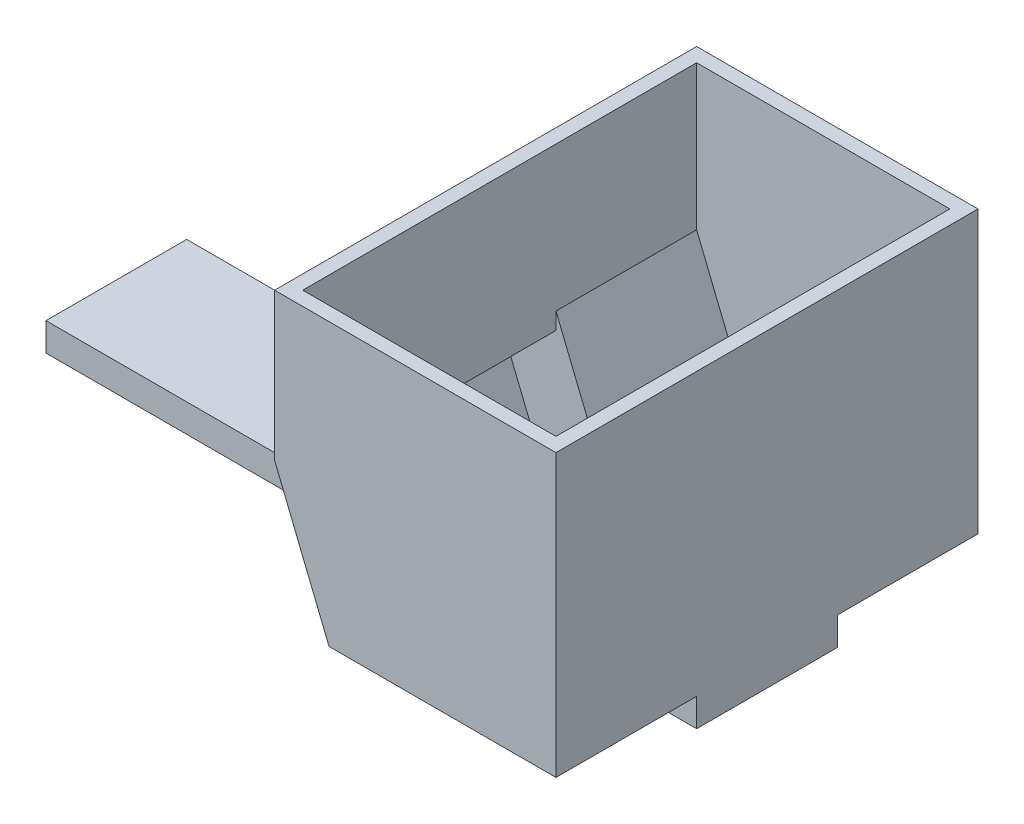
ISO-10303-21;
HEADER;
FILE_DESCRIPTION(('STEP AP214'),'2;1');
FILE_NAME('part.step','',(''),(''),'','','');
FILE_SCHEMA(('AUTOMOTIVE_DESIGN { 1 0 10303 214 1 1 1 1 }'));
ENDSEC;
DATA;
#1=APPLICATION_CONTEXT('core data for automotive mechanical design processes');
#2=APPLICATION_PROTOCOL_DEFINITION('international standard','automotive_design',2000,#1);
#3=PRODUCT_CONTEXT('',#1,'mechanical');
#4=PRODUCT('Part','Part','',(#3));
#5=PRODUCT_RELATED_PRODUCT_CATEGORY('part','',(#4));
#6=PRODUCT_DEFINITION_FORMATION('','',#4);
#7=PRODUCT_DEFINITION_CONTEXT('part definition',#1,'design');
#8=PRODUCT_DEFINITION('design','',#6,#7);
#9=PRODUCT_DEFINITION_SHAPE('','',#8);
#10=(LENGTH_UNIT() NAMED_UNIT(*) SI_UNIT(.MILLI.,.METRE.));
#11=(NAMED_UNIT(*) PLANE_ANGLE_UNIT() SI_UNIT($,.RADIAN.));
#12=(NAMED_UNIT(*) SI_UNIT($,.STERADIAN.) SOLID_ANGLE_UNIT());
#13=UNCERTAINTY_MEASURE_WITH_UNIT(LENGTH_MEASURE(1.E-05),#10,'distance_accuracy_value','');
#14=(GEOMETRIC_REPRESENTATION_CONTEXT(3) GLOBAL_UNCERTAINTY_ASSIGNED_CONTEXT((#13)) GLOBAL_UNIT_ASSIGNED_CONTEXT((#10,
#11,#12)) REPRESENTATION_CONTEXT('',''));
#15=CARTESIAN_POINT('',(0.,0.,0.));
#16=DIRECTION('',(0.,0.,1.));
#17=DIRECTION('',(1.,0.,0.));
#18=AXIS2_PLACEMENT_3D('',#15,#16,#17);
#19=CARTESIAN_POINT('',(0.,-482.915977060569,2000.));
#20=DIRECTION('',(0.,1.,0.));
#21=DIRECTION('',(0.,0.,1.));
#22=AXIS2_PLACEMENT_3D('',#19,#20,#21);
#23=PLANE('',#22);
#24=DIRECTION('',(1.,0.,0.));
#25=VECTOR('',#24,1.);
#26=CARTESIAN_POINT('',(0.,-482.915977060569,0.));
#27=LINE('',#26,#25);
#28=CARTESIAN_POINT('',(4250.,-482.915977060569,0.));
#29=VERTEX_POINT('',#28);
#30=CARTESIAN_POINT('',(5250.,-482.915977060569,0.));
#31=VERTEX_POINT('',#30);
#32=EDGE_CURVE('E166',#29,#31,#27,.T.);
#33=ORIENTED_EDGE('',*,*,#32,.F.);
#34=DIRECTION('',(0.,0.,-1.));
#35=VECTOR('',#34,1.);
#36=CARTESIAN_POINT('',(4250.,-482.915977060569,2000.));
#37=LINE('',#36,#35);
#38=CARTESIAN_POINT('',(4250.,-482.915977060569,2000.));
#39=VERTEX_POINT('',#38);
#40=EDGE_CURVE('E53',#39,#29,#37,.T.);
#41=ORIENTED_EDGE('',*,*,#40,.F.);
#42=DIRECTION('',(1.,0.,0.));
#43=VECTOR('',#42,1.);
#44=CARTESIAN_POINT('',(0.,-482.915977060569,2000.));
#45=LINE('',#44,#43);
#46=CARTESIAN_POINT('',(5250.,-482.915977060569,2000.));
#47=VERTEX_POINT('',#46);
#48=EDGE_CURVE('E142',#39,#47,#45,.T.);
#49=ORIENTED_EDGE('',*,*,#48,.T.);
#50=DIRECTION('',(0.,0.,-1.));
#51=VECTOR('',#50,1.);
#52=CARTESIAN_POINT('',(5250.,-482.915977060569,2000.));
#53=LINE('',#52,#51);
#54=EDGE_CURVE('E11',#47,#31,#53,.T.);
#55=ORIENTED_EDGE('',*,*,#54,.T.);
#56=EDGE_LOOP('',(#33,#41,#49,#55));
#57=FACE_BOUND('',#56,.T.);
#58=ADVANCED_FACE('F45',(#57),#23,.T.);
#59=CARTESIAN_POINT('',(3479.3535466824,1413.73185883282,2000.));
#60=DIRECTION('',(0.926443875866131,0.376432922139045,0.));
#61=DIRECTION('',(-0.376432922139045,0.926443875866131,0.));
#62=AXIS2_PLACEMENT_3D('',#59,#60,#61);
#63=PLANE('',#62);
#64=DIRECTION('',(0.376432922139045,-0.926443875866131,0.));
#65=VECTOR('',#64,1.);
#66=CARTESIAN_POINT('',(3479.3535466824,1413.73185883282,0.));
#67=LINE('',#66,#65);
#68=CARTESIAN_POINT('',(5023.74065912223,-2387.17900240678,0.));
#69=VERTEX_POINT('',#68);
#70=EDGE_CURVE('E171',#29,#69,#67,.T.);
#71=ORIENTED_EDGE('',*,*,#70,.T.);
#72=DIRECTION('',(0.,0.,-1.));
#73=VECTOR('',#72,1.);
#74=CARTESIAN_POINT('',(5023.74065912223,-2387.17900240678,2000.));
#75=LINE('',#74,#73);
#76=CARTESIAN_POINT('',(5023.74065912223,-2387.17900240678,2000.));
#77=VERTEX_POINT('',#76);
#78=EDGE_CURVE('E124',#77,#69,#75,.T.);
#79=ORIENTED_EDGE('',*,*,#78,.F.);
#80=DIRECTION('',(0.376432922139045,-0.926443875866131,0.));
#81=VECTOR('',#80,1.);
#82=CARTESIAN_POINT('',(3479.3535466824,1413.73185883282,2000.));
#83=LINE('',#82,#81);
#84=EDGE_CURVE('E136',#39,#77,#83,.T.);
#85=ORIENTED_EDGE('',*,*,#84,.F.);
#86=ORIENTED_EDGE('',*,*,#40,.T.);
#87=EDGE_LOOP('',(#71,#79,#85,#86));
#88=FACE_BOUND('',#87,.T.);
#89=ADVANCED_FACE('F195',(#88),#63,.F.);
#90=CARTESIAN_POINT('',(0.,-2387.17900240678,2000.));
#91=DIRECTION('',(0.,1.,0.));
#92=DIRECTION('',(0.,0.,1.));
#93=AXIS2_PLACEMENT_3D('',#90,#91,#92);
#94=PLANE('',#93);
#95=DIRECTION('',(1.,0.,0.));
#96=VECTOR('',#95,1.);
#97=CARTESIAN_POINT('',(0.,-2387.17900240678,0.));
#98=LINE('',#97,#96);
#99=CARTESIAN_POINT('',(0.,-2387.17900240678,0.));
#100=VERTEX_POINT('',#99);
#101=EDGE_CURVE('E120',#100,#69,#98,.T.);
#102=ORIENTED_EDGE('',*,*,#101,.F.);
#103=DIRECTION('',(0.,0.,-1.));
#104=VECTOR('',#103,1.);
#105=CARTESIAN_POINT('',(0.,-2387.17900240678,2000.));
#106=LINE('',#105,#104);
#107=CARTESIAN_POINT('',(0.,-2387.17900240678,2000.));
#108=VERTEX_POINT('',#107);
#109=EDGE_CURVE('E114',#108,#100,#106,.T.);
#110=ORIENTED_EDGE('',*,*,#109,.F.);
#111=DIRECTION('',(1.,0.,0.));
#112=VECTOR('',#111,1.);
#113=CARTESIAN_POINT('',(0.,-2387.17900240678,2000.));
#114=LINE('',#113,#112);
#115=EDGE_CURVE('E118',#108,#77,#114,.T.);
#116=ORIENTED_EDGE('',*,*,#115,.T.);
#117=ORIENTED_EDGE('',*,*,#78,.T.);
#118=EDGE_LOOP('',(#102,#110,#116,#117));
#119=FACE_BOUND('',#118,.T.);
#120=ADVANCED_FACE('F116',(#119),#94,.T.);
#121=CARTESIAN_POINT('',(0.,0.,2000.));
#122=DIRECTION('',(1.,0.,0.));
#123=DIRECTION('',(0.,0.,-1.));
#124=AXIS2_PLACEMENT_3D('',#121,#122,#123);
#125=PLANE('',#124);
#126=DIRECTION('',(0.,-1.,0.));
#127=VECTOR('',#126,1.);
#128=CARTESIAN_POINT('',(0.,0.,0.));
#129=LINE('',#128,#127);
#130=CARTESIAN_POINT('',(0.,-2787.17900240678,0.));
#131=VERTEX_POINT('',#130);
#132=EDGE_CURVE('E177',#100,#131,#129,.T.);
#133=ORIENTED_EDGE('',*,*,#132,.T.);
#134=DIRECTION('',(0.,0.,-1.));
#135=VECTOR('',#134,1.);
#136=CARTESIAN_POINT('',(0.,-2787.17900240678,2000.));
#137=LINE('',#136,#135);
#138=CARTESIAN_POINT('',(0.,-2787.17900240678,2000.));
#139=VERTEX_POINT('',#138);
#140=EDGE_CURVE('E125',#139,#131,#137,.T.);
#141=ORIENTED_EDGE('',*,*,#140,.F.);
#142=DIRECTION('',(0.,-1.,0.));
#143=VECTOR('',#142,1.);
#144=CARTESIAN_POINT('',(0.,0.,2000.));
#145=LINE('',#144,#143);
#146=EDGE_CURVE('E128',#108,#139,#145,.T.);
#147=ORIENTED_EDGE('',*,*,#146,.F.);
#148=ORIENTED_EDGE('',*,*,#109,.T.);
#149=EDGE_LOOP('',(#133,#141,#147,#148));
#150=FACE_BOUND('',#149,.T.);
#151=ADVANCED_FACE('F129',(#150),#125,.F.);
#152=CARTESIAN_POINT('',(0.,-2787.17900240678,2000.));
#153=DIRECTION('',(0.,1.,0.));
#154=DIRECTION('',(0.,0.,1.));
#155=AXIS2_PLACEMENT_3D('',#152,#153,#154);
#156=PLANE('',#155);
#157=DIRECTION('',(1.,0.,0.));
#158=VECTOR('',#157,1.);
#159=CARTESIAN_POINT('',(0.,-2787.17900240678,0.));
#160=LINE('',#159,#158);
#161=CARTESIAN_POINT('',(9250.,-2787.17900240678,0.));
#162=VERTEX_POINT('',#161);
#163=EDGE_CURVE('E181',#131,#162,#160,.T.);
#164=ORIENTED_EDGE('',*,*,#163,.T.);
#165=DIRECTION('',(0.,0.,-1.));
#166=VECTOR('',#165,1.);
#167=CARTESIAN_POINT('',(9250.,-2787.17900240678,2000.));
#168=LINE('',#167,#166);
#169=CARTESIAN_POINT('',(9250.,-2787.17900240678,2000.));
#170=VERTEX_POINT('',#169);
#171=EDGE_CURVE('E146',#170,#162,#168,.T.);
#172=ORIENTED_EDGE('',*,*,#171,.F.);
#173=DIRECTION('',(1.,0.,0.));
#174=VECTOR('',#173,1.);
#175=CARTESIAN_POINT('',(0.,-2787.17900240678,2000.));
#176=LINE('',#175,#174);
#177=EDGE_CURVE('E69',#139,#170,#176,.T.);
#178=ORIENTED_EDGE('',*,*,#177,.F.);
#179=ORIENTED_EDGE('',*,*,#140,.T.);
#180=EDGE_LOOP('',(#164,#172,#178,#179));
#181=FACE_BOUND('',#180,.T.);
#182=ADVANCED_FACE('F461',(#181),#156,.F.);
#183=CARTESIAN_POINT('',(9250.,0.,2000.));
#184=DIRECTION('',(1.,0.,0.));
#185=DIRECTION('',(0.,0.,-1.));
#186=AXIS2_PLACEMENT_3D('',#183,#184,#185);
#187=PLANE('',#186);
#188=DIRECTION('',(0.,-1.,0.));
#189=VECTOR('',#188,1.);
#190=CARTESIAN_POINT('',(9250.,0.,0.));
#191=LINE('',#190,#189);
#192=CARTESIAN_POINT('',(9250.,-2387.17900240678,0.));
#193=VERTEX_POINT('',#192);
#194=EDGE_CURVE('E185',#193,#162,#191,.T.);
#195=ORIENTED_EDGE('',*,*,#194,.F.);
#196=DIRECTION('',(0.,0.,1.));
#197=VECTOR('',#196,1.);
#198=CARTESIAN_POINT('',(9250.,-2387.17900240678,-2000.));
#199=LINE('',#198,#197);
#200=CARTESIAN_POINT('',(9250.,-2387.17900240678,-2000.));
#201=VERTEX_POINT('',#200);
#202=EDGE_CURVE('E239',#201,#193,#199,.T.);
#203=ORIENTED_EDGE('',*,*,#202,.F.);
#204=DIRECTION('',(0.,1.,0.));
#205=VECTOR('',#204,1.);
#206=CARTESIAN_POINT('',(9250.,-4.10782519111308E-12,-2000.));
#207=LINE('',#206,#205);
#208=CARTESIAN_POINT('',(9250.,1612.82099759322,-2000.));
#209=VERTEX_POINT('',#208);
#210=EDGE_CURVE('E232',#201,#209,#207,.T.);
#211=ORIENTED_EDGE('',*,*,#210,.T.);
#212=DIRECTION('',(0.,0.,1.));
#213=VECTOR('',#212,1.);
#214=CARTESIAN_POINT('',(9250.,1612.82099759322,-2000.));
#215=LINE('',#214,#213);
#216=CARTESIAN_POINT('',(9250.,1612.82099759322,4000.));
#217=VERTEX_POINT('',#216);
#218=EDGE_CURVE('E167',#209,#217,#215,.T.);
#219=ORIENTED_EDGE('',*,*,#218,.T.);
#220=DIRECTION('',(0.,1.,0.));
#221=VECTOR('',#220,1.);
#222=CARTESIAN_POINT('',(9250.,-4.10782519111308E-12,4000.));
#223=LINE('',#222,#221);
#224=CARTESIAN_POINT('',(9250.,-2387.17900240678,4000.));
#225=VERTEX_POINT('',#224);
#226=EDGE_CURVE('E263',#225,#217,#223,.T.);
#227=ORIENTED_EDGE('',*,*,#226,.F.);
#228=CARTESIAN_POINT('',(9250.,-2387.17900240678,2000.));
#229=VERTEX_POINT('',#228);
#230=EDGE_CURVE('E238',#229,#225,#199,.T.);
#231=ORIENTED_EDGE('',*,*,#230,.F.);
#232=DIRECTION('',(0.,-1.,0.));
#233=VECTOR('',#232,1.);
#234=CARTESIAN_POINT('',(9250.,0.,2000.));
#235=LINE('',#234,#233);
#236=EDGE_CURVE('E147',#229,#170,#235,.T.);
#237=ORIENTED_EDGE('',*,*,#236,.T.);
#238=ORIENTED_EDGE('',*,*,#171,.T.);
#239=EDGE_LOOP('',(#195,#203,#211,#219,#227,#231,#237,#238));
#240=FACE_BOUND('',#239,.T.);
#241=ADVANCED_FACE('F464',(#240),#187,.T.);
#242=CARTESIAN_POINT('',(0.,0.,2000.));
#243=DIRECTION('',(0.,0.,1.));
#244=DIRECTION('',(1.,0.,0.));
#245=AXIS2_PLACEMENT_3D('',#242,#243,#244);
#246=PLANE('',#245);
#247=CARTESIAN_POINT('',(4895.35301422682,-895.900869711244,2000.));
#248=DIRECTION('',(0.,0.,1.));
#249=DIRECTION('',(1.,0.,0.));
#250=AXIS2_PLACEMENT_3D('',#247,#248,#249);
#251=CIRCLE('',#250,100.);
#252=CARTESIAN_POINT('',(4995.35301422682,-895.900869711244,2000.));
#253=VERTEX_POINT('',#252);
#254=EDGE_CURVE('E423',#253,#253,#251,.T.);
#255=ORIENTED_EDGE('',*,*,#254,.F.);
#256=EDGE_LOOP('',(#255));
#257=FACE_BOUND('',#256,.T.);
#258=DIRECTION('',(0.376432922139045,-0.926443875866131,0.));
#259=VECTOR('',#258,1.);
#260=CARTESIAN_POINT('',(4337.65180181226,1762.47583422293,2000.));
#261=LINE('',#260,#259);
#262=CARTESIAN_POINT('',(6023.74065912223,-2387.17900240678,2000.));
#263=VERTEX_POINT('',#262);
#264=EDGE_CURVE('E218',#47,#263,#261,.T.);
#265=ORIENTED_EDGE('',*,*,#264,.F.);
#266=ORIENTED_EDGE('',*,*,#48,.F.);
#267=ORIENTED_EDGE('',*,*,#84,.T.);
#268=ORIENTED_EDGE('',*,*,#115,.F.);
#269=ORIENTED_EDGE('',*,*,#146,.T.);
#270=ORIENTED_EDGE('',*,*,#177,.T.);
#271=ORIENTED_EDGE('',*,*,#236,.F.);
#272=EDGE_CURVE('E140',#263,#229,#114,.T.);
#273=ORIENTED_EDGE('',*,*,#272,.F.);
#274=EDGE_LOOP('',(#265,#266,#267,#268,#269,#270,#271,#273));
#275=FACE_BOUND('',#274,.T.);
#276=ADVANCED_FACE('F134',(#257,#275),#246,.T.);
#277=CARTESIAN_POINT('',(0.,0.,0.));
#278=DIRECTION('',(0.,0.,1.));
#279=DIRECTION('',(1.,0.,0.));
#280=AXIS2_PLACEMENT_3D('',#277,#278,#279);
#281=PLANE('',#280);
#282=CARTESIAN_POINT('',(5156.86100387001,-1595.06633267698,0.));
#283=DIRECTION('',(0.,0.,1.));
#284=DIRECTION('',(1.,0.,0.));
#285=AXIS2_PLACEMENT_3D('',#282,#283,#284);
#286=CIRCLE('',#285,100.);
#287=CARTESIAN_POINT('',(5256.86100387001,-1595.06633267698,0.));
#288=VERTEX_POINT('',#287);
#289=EDGE_CURVE('E431',#288,#288,#286,.T.);
#290=ORIENTED_EDGE('',*,*,#289,.T.);
#291=EDGE_LOOP('',(#290));
#292=FACE_BOUND('',#291,.T.);
#293=DIRECTION('',(0.376432922139045,-0.926443875866131,0.));
#294=VECTOR('',#293,1.);
#295=CARTESIAN_POINT('',(4337.65180181226,1762.47583422293,0.));
#296=LINE('',#295,#294);
#297=CARTESIAN_POINT('',(6023.74065912223,-2387.17900240678,0.));
#298=VERTEX_POINT('',#297);
#299=EDGE_CURVE('E162',#31,#298,#296,.T.);
#300=ORIENTED_EDGE('',*,*,#299,.T.);
#301=EDGE_CURVE('E178',#298,#193,#98,.T.);
#302=ORIENTED_EDGE('',*,*,#301,.T.);
#303=ORIENTED_EDGE('',*,*,#194,.T.);
#304=ORIENTED_EDGE('',*,*,#163,.F.);
#305=ORIENTED_EDGE('',*,*,#132,.F.);
#306=ORIENTED_EDGE('',*,*,#101,.T.);
#307=ORIENTED_EDGE('',*,*,#70,.F.);
#308=ORIENTED_EDGE('',*,*,#32,.T.);
#309=EDGE_LOOP('',(#300,#302,#303,#304,#305,#306,#307,#308));
#310=FACE_BOUND('',#309,.T.);
#311=ADVANCED_FACE('F197',(#292,#310),#281,.F.);
#312=CARTESIAN_POINT('',(0.,-2387.17900240678,-2000.));
#313=DIRECTION('',(0.,-1.,0.));
#314=DIRECTION('',(0.,0.,-1.));
#315=AXIS2_PLACEMENT_3D('',#312,#313,#314);
#316=PLANE('',#315);
#317=ORIENTED_EDGE('',*,*,#301,.F.);
#318=DIRECTION('',(0.,0.,1.));
#319=VECTOR('',#318,1.);
#320=CARTESIAN_POINT('',(6023.74065912223,-2387.17900240678,-2000.));
#321=LINE('',#320,#319);
#322=CARTESIAN_POINT('',(6023.74065912223,-2387.17900240678,-2000.));
#323=VERTEX_POINT('',#322);
#324=EDGE_CURVE('E97',#323,#298,#321,.T.);
#325=ORIENTED_EDGE('',*,*,#324,.F.);
#326=DIRECTION('',(1.,0.,0.));
#327=VECTOR('',#326,1.);
#328=CARTESIAN_POINT('',(0.,-2387.17900240678,-2000.));
#329=LINE('',#328,#327);
#330=EDGE_CURVE('E249',#323,#201,#329,.T.);
#331=ORIENTED_EDGE('',*,*,#330,.T.);
#332=ORIENTED_EDGE('',*,*,#202,.T.);
#333=EDGE_LOOP('',(#317,#325,#331,#332));
#334=FACE_BOUND('',#333,.T.);
#335=ADVANCED_FACE('F470',(#334),#316,.T.);
#336=CARTESIAN_POINT('',(4337.65180181226,1762.47583422293,-2000.));
#337=DIRECTION('',(-0.926443875866131,-0.376432922139045,0.));
#338=DIRECTION('',(0.376432922139045,-0.926443875866131,0.));
#339=AXIS2_PLACEMENT_3D('',#336,#337,#338);
#340=PLANE('',#339);
#341=ORIENTED_EDGE('',*,*,#299,.F.);
#342=DIRECTION('',(0.,0.,1.));
#343=VECTOR('',#342,1.);
#344=CARTESIAN_POINT('',(5250.,-482.915977060569,-2000.));
#345=LINE('',#344,#343);
#346=CARTESIAN_POINT('',(5250.,-482.915977060569,-2000.));
#347=VERTEX_POINT('',#346);
#348=EDGE_CURVE('E214',#347,#31,#345,.T.);
#349=ORIENTED_EDGE('',*,*,#348,.F.);
#350=DIRECTION('',(0.376432922139045,-0.926443875866131,0.));
#351=VECTOR('',#350,1.);
#352=CARTESIAN_POINT('',(4337.65180181226,1762.47583422293,-2000.));
#353=LINE('',#352,#351);
#354=EDGE_CURVE('E253',#347,#323,#353,.T.);
#355=ORIENTED_EDGE('',*,*,#354,.T.);
#356=ORIENTED_EDGE('',*,*,#324,.T.);
#357=EDGE_LOOP('',(#341,#349,#355,#356));
#358=FACE_BOUND('',#357,.T.);
#359=ADVANCED_FACE('F479',(#358),#340,.T.);
#360=CARTESIAN_POINT('',(0.,1612.82099759322,-2000.));
#361=DIRECTION('',(0.,1.,0.));
#362=DIRECTION('',(0.,0.,1.));
#363=AXIS2_PLACEMENT_3D('',#360,#361,#362);
#364=PLANE('',#363);
#365=DIRECTION('',(0.,0.,1.));
#366=VECTOR('',#365,1.);
#367=CARTESIAN_POINT('',(5450.,1612.82099759322,-2000.));
#368=LINE('',#367,#366);
#369=CARTESIAN_POINT('',(5450.,1612.82099759322,-1800.));
#370=VERTEX_POINT('',#369);
#371=CARTESIAN_POINT('',(5450.,1612.82099759322,3800.));
#372=VERTEX_POINT('',#371);
#373=EDGE_CURVE('E289',#370,#372,#368,.T.);
#374=ORIENTED_EDGE('',*,*,#373,.F.);
#375=DIRECTION('',(-1.,0.,0.));
#376=VECTOR('',#375,1.);
#377=CARTESIAN_POINT('',(0.,1612.82099759322,-1800.));
#378=LINE('',#377,#376);
#379=CARTESIAN_POINT('',(9050.,1612.82099759322,-1800.));
#380=VERTEX_POINT('',#379);
#381=EDGE_CURVE('E294',#380,#370,#378,.T.);
#382=ORIENTED_EDGE('',*,*,#381,.F.);
#383=DIRECTION('',(0.,0.,1.));
#384=VECTOR('',#383,1.);
#385=CARTESIAN_POINT('',(9050.,1612.82099759322,2000.));
#386=LINE('',#385,#384);
#387=CARTESIAN_POINT('',(9050.,1612.82099759322,3800.));
#388=VERTEX_POINT('',#387);
#389=EDGE_CURVE('E299',#380,#388,#386,.T.);
#390=ORIENTED_EDGE('',*,*,#389,.T.);
#391=DIRECTION('',(-1.,0.,0.));
#392=VECTOR('',#391,1.);
#393=CARTESIAN_POINT('',(0.,1612.82099759322,3800.));
#394=LINE('',#393,#392);
#395=EDGE_CURVE('E283',#388,#372,#394,.T.);
#396=ORIENTED_EDGE('',*,*,#395,.T.);
#397=EDGE_LOOP('',(#374,#382,#390,#396));
#398=FACE_BOUND('',#397,.T.);
#399=DIRECTION('',(0.,0.,1.));
#400=VECTOR('',#399,1.);
#401=CARTESIAN_POINT('',(5250.,1612.82099759322,-2000.));
#402=LINE('',#401,#400);
#403=CARTESIAN_POINT('',(5250.,1612.82099759322,-2000.));
#404=VERTEX_POINT('',#403);
#405=CARTESIAN_POINT('',(5250.,1612.82099759322,4000.));
#406=VERTEX_POINT('',#405);
#407=EDGE_CURVE('E228',#404,#406,#402,.T.);
#408=ORIENTED_EDGE('',*,*,#407,.T.);
#409=DIRECTION('',(-1.,0.,0.));
#410=VECTOR('',#409,1.);
#411=CARTESIAN_POINT('',(0.,1612.82099759322,4000.));
#412=LINE('',#411,#410);
#413=EDGE_CURVE('E278',#217,#406,#412,.T.);
#414=ORIENTED_EDGE('',*,*,#413,.F.);
#415=ORIENTED_EDGE('',*,*,#218,.F.);
#416=DIRECTION('',(-1.,0.,0.));
#417=VECTOR('',#416,1.);
#418=CARTESIAN_POINT('',(0.,1612.82099759322,-2000.));
#419=LINE('',#418,#417);
#420=EDGE_CURVE('E259',#209,#404,#419,.T.);
#421=ORIENTED_EDGE('',*,*,#420,.T.);
#422=EDGE_LOOP('',(#408,#414,#415,#421));
#423=FACE_BOUND('',#422,.T.);
#424=ADVANCED_FACE('F475',(#398,#423),#364,.T.);
#425=CARTESIAN_POINT('',(6023.74065912223,-2387.17900240678,4000.));
#426=VERTEX_POINT('',#425);
#427=EDGE_CURVE('E235',#263,#426,#321,.T.);
#428=ORIENTED_EDGE('',*,*,#427,.F.);
#429=ORIENTED_EDGE('',*,*,#272,.T.);
#430=ORIENTED_EDGE('',*,*,#230,.T.);
#431=DIRECTION('',(1.,0.,0.));
#432=VECTOR('',#431,1.);
#433=CARTESIAN_POINT('',(0.,-2387.17900240678,4000.));
#434=LINE('',#433,#432);
#435=EDGE_CURVE('E267',#426,#225,#434,.T.);
#436=ORIENTED_EDGE('',*,*,#435,.F.);
#437=EDGE_LOOP('',(#428,#429,#430,#436));
#438=FACE_BOUND('',#437,.T.);
#439=ADVANCED_FACE('F478',(#438),#316,.T.);
#440=CARTESIAN_POINT('',(5250.,-482.915977060569,4000.));
#441=VERTEX_POINT('',#440);
#442=EDGE_CURVE('E210',#47,#441,#345,.T.);
#443=ORIENTED_EDGE('',*,*,#442,.F.);
#444=ORIENTED_EDGE('',*,*,#264,.T.);
#445=ORIENTED_EDGE('',*,*,#427,.T.);
#446=DIRECTION('',(0.376432922139045,-0.926443875866131,0.));
#447=VECTOR('',#446,1.);
#448=CARTESIAN_POINT('',(4337.65180181226,1762.47583422293,4000.));
#449=LINE('',#448,#447);
#450=EDGE_CURVE('E271',#441,#426,#449,.T.);
#451=ORIENTED_EDGE('',*,*,#450,.F.);
#452=EDGE_LOOP('',(#443,#444,#445,#451));
#453=FACE_BOUND('',#452,.T.);
#454=ADVANCED_FACE('F484',(#453),#340,.T.);
#455=CARTESIAN_POINT('',(5250.,0.,-2000.));
#456=DIRECTION('',(-1.,0.,0.));
#457=DIRECTION('',(0.,0.,1.));
#458=AXIS2_PLACEMENT_3D('',#455,#456,#457);
#459=PLANE('',#458);
#460=ORIENTED_EDGE('',*,*,#348,.T.);
#461=ORIENTED_EDGE('',*,*,#54,.F.);
#462=ORIENTED_EDGE('',*,*,#442,.T.);
#463=DIRECTION('',(0.,-1.,0.));
#464=VECTOR('',#463,1.);
#465=CARTESIAN_POINT('',(5250.,0.,4000.));
#466=LINE('',#465,#464);
#467=EDGE_CURVE('E275',#406,#441,#466,.T.);
#468=ORIENTED_EDGE('',*,*,#467,.F.);
#469=ORIENTED_EDGE('',*,*,#407,.F.);
#470=DIRECTION('',(0.,-1.,0.));
#471=VECTOR('',#470,1.);
#472=CARTESIAN_POINT('',(5250.,0.,-2000.));
#473=LINE('',#472,#471);
#474=EDGE_CURVE('E256',#404,#347,#473,.T.);
#475=ORIENTED_EDGE('',*,*,#474,.T.);
#476=EDGE_LOOP('',(#460,#461,#462,#468,#469,#475));
#477=FACE_BOUND('',#476,.T.);
#478=ADVANCED_FACE('F206',(#477),#459,.T.);
#479=CARTESIAN_POINT('',(0.,0.,-2000.));
#480=DIRECTION('',(0.,0.,1.));
#481=DIRECTION('',(1.,0.,0.));
#482=AXIS2_PLACEMENT_3D('',#479,#480,#481);
#483=PLANE('',#482);
#484=ORIENTED_EDGE('',*,*,#420,.F.);
#485=ORIENTED_EDGE('',*,*,#210,.F.);
#486=ORIENTED_EDGE('',*,*,#330,.F.);
#487=ORIENTED_EDGE('',*,*,#354,.F.);
#488=ORIENTED_EDGE('',*,*,#474,.F.);
#489=EDGE_LOOP('',(#484,#485,#486,#487,#488));
#490=FACE_BOUND('',#489,.T.);
#491=ADVANCED_FACE('F483',(#490),#483,.F.);
#492=CARTESIAN_POINT('',(0.,0.,4000.));
#493=DIRECTION('',(0.,0.,1.));
#494=DIRECTION('',(1.,0.,0.));
#495=AXIS2_PLACEMENT_3D('',#492,#493,#494);
#496=PLANE('',#495);
#497=ORIENTED_EDGE('',*,*,#413,.T.);
#498=ORIENTED_EDGE('',*,*,#467,.T.);
#499=ORIENTED_EDGE('',*,*,#450,.T.);
#500=ORIENTED_EDGE('',*,*,#435,.T.);
#501=ORIENTED_EDGE('',*,*,#226,.T.);
#502=EDGE_LOOP('',(#497,#498,#499,#500,#501));
#503=FACE_BOUND('',#502,.T.);
#504=ADVANCED_FACE('F491',(#503),#496,.T.);
#505=CARTESIAN_POINT('',(0.,-682.915977060569,2000.));
#506=DIRECTION('',(0.,1.,0.));
#507=DIRECTION('',(0.,0.,1.));
#508=AXIS2_PLACEMENT_3D('',#505,#506,#507);
#509=PLANE('',#508);
#510=DIRECTION('',(1.,0.,0.));
#511=VECTOR('',#510,1.);
#512=CARTESIAN_POINT('',(0.,-682.915977060569,200.));
#513=LINE('',#512,#511);
#514=CARTESIAN_POINT('',(4547.1432934029,-682.915977060569,200.));
#515=VERTEX_POINT('',#514);
#516=CARTESIAN_POINT('',(5450.,-682.915977060569,200.));
#517=VERTEX_POINT('',#516);
#518=EDGE_CURVE('E335',#515,#517,#513,.T.);
#519=ORIENTED_EDGE('',*,*,#518,.T.);
#520=DIRECTION('',(0.,0.,-1.));
#521=VECTOR('',#520,1.);
#522=CARTESIAN_POINT('',(5450.,-682.915977060569,-2000.));
#523=LINE('',#522,#521);
#524=CARTESIAN_POINT('',(5450.,-682.915977060569,1800.));
#525=VERTEX_POINT('',#524);
#526=EDGE_CURVE('E312',#525,#517,#523,.T.);
#527=ORIENTED_EDGE('',*,*,#526,.F.);
#528=DIRECTION('',(1.,0.,0.));
#529=VECTOR('',#528,1.);
#530=CARTESIAN_POINT('',(0.,-682.915977060569,1800.));
#531=LINE('',#530,#529);
#532=CARTESIAN_POINT('',(4547.1432934029,-682.915977060569,1800.));
#533=VERTEX_POINT('',#532);
#534=EDGE_CURVE('E369',#533,#525,#531,.T.);
#535=ORIENTED_EDGE('',*,*,#534,.F.);
#536=DIRECTION('',(0.,0.,-1.));
#537=VECTOR('',#536,1.);
#538=CARTESIAN_POINT('',(4547.1432934029,-682.915977060569,2000.));
#539=LINE('',#538,#537);
#540=EDGE_CURVE('E407',#533,#515,#539,.T.);
#541=ORIENTED_EDGE('',*,*,#540,.T.);
#542=EDGE_LOOP('',(#519,#527,#535,#541));
#543=FACE_BOUND('',#542,.T.);
#544=ADVANCED_FACE('F495',(#543),#509,.F.);
#545=CARTESIAN_POINT('',(3664.64232185563,1489.01844326063,2000.));
#546=DIRECTION('',(0.926443875866131,0.376432922139045,0.));
#547=DIRECTION('',(-0.376432922139045,0.926443875866131,0.));
#548=AXIS2_PLACEMENT_3D('',#545,#546,#547);
#549=PLANE('',#548);
#550=DIRECTION('',(0.376432922139045,-0.926443875866131,0.));
#551=VECTOR('',#550,1.);
#552=CARTESIAN_POINT('',(3664.64232185563,1489.01844326063,200.));
#553=LINE('',#552,#551);
#554=CARTESIAN_POINT('',(5320.88395252513,-2587.17900240678,200.));
#555=VERTEX_POINT('',#554);
#556=EDGE_CURVE('E400',#515,#555,#553,.T.);
#557=ORIENTED_EDGE('',*,*,#556,.F.);
#558=ORIENTED_EDGE('',*,*,#540,.F.);
#559=DIRECTION('',(0.376432922139045,-0.926443875866131,0.));
#560=VECTOR('',#559,1.);
#561=CARTESIAN_POINT('',(3664.64232185563,1489.01844326063,1800.));
#562=LINE('',#561,#560);
#563=CARTESIAN_POINT('',(5320.88395252513,-2587.17900240678,1800.));
#564=VERTEX_POINT('',#563);
#565=EDGE_CURVE('E392',#533,#564,#562,.T.);
#566=ORIENTED_EDGE('',*,*,#565,.T.);
#567=DIRECTION('',(0.,0.,-1.));
#568=VECTOR('',#567,1.);
#569=CARTESIAN_POINT('',(5320.88395252513,-2587.17900240678,2000.));
#570=LINE('',#569,#568);
#571=EDGE_CURVE('E396',#564,#555,#570,.T.);
#572=ORIENTED_EDGE('',*,*,#571,.T.);
#573=EDGE_LOOP('',(#557,#558,#566,#572));
#574=FACE_BOUND('',#573,.T.);
#575=ADVANCED_FACE('F534',(#574),#549,.T.);
#576=CARTESIAN_POINT('',(0.,-2587.17900240678,2000.));
#577=DIRECTION('',(0.,1.,0.));
#578=DIRECTION('',(0.,0.,1.));
#579=AXIS2_PLACEMENT_3D('',#576,#577,#578);
#580=PLANE('',#579);
#581=ORIENTED_EDGE('',*,*,#571,.F.);
#582=DIRECTION('',(1.,0.,0.));
#583=VECTOR('',#582,1.);
#584=CARTESIAN_POINT('',(0.,-2587.17900240678,1800.));
#585=LINE('',#584,#583);
#586=CARTESIAN_POINT('',(9050.,-2587.17900240678,1800.));
#587=VERTEX_POINT('',#586);
#588=EDGE_CURVE('E373',#564,#587,#585,.T.);
#589=ORIENTED_EDGE('',*,*,#588,.T.);
#590=DIRECTION('',(0.,0.,-1.));
#591=VECTOR('',#590,1.);
#592=CARTESIAN_POINT('',(9050.,-2587.17900240678,2000.));
#593=LINE('',#592,#591);
#594=CARTESIAN_POINT('',(9050.,-2587.17900240678,200.));
#595=VERTEX_POINT('',#594);
#596=EDGE_CURVE('E364',#587,#595,#593,.T.);
#597=ORIENTED_EDGE('',*,*,#596,.T.);
#598=DIRECTION('',(1.,0.,0.));
#599=VECTOR('',#598,1.);
#600=CARTESIAN_POINT('',(0.,-2587.17900240678,200.));
#601=LINE('',#600,#599);
#602=EDGE_CURVE('E388',#555,#595,#601,.T.);
#603=ORIENTED_EDGE('',*,*,#602,.F.);
#604=EDGE_LOOP('',(#581,#589,#597,#603));
#605=FACE_BOUND('',#604,.T.);
#606=ADVANCED_FACE('F530',(#605),#580,.T.);
#607=CARTESIAN_POINT('',(9050.,0.,2000.));
#608=DIRECTION('',(1.,0.,0.));
#609=DIRECTION('',(0.,0.,-1.));
#610=AXIS2_PLACEMENT_3D('',#607,#608,#609);
#611=PLANE('',#610);
#612=DIRECTION('',(0.,-1.,0.));
#613=VECTOR('',#612,1.);
#614=CARTESIAN_POINT('',(9050.,0.,200.));
#615=LINE('',#614,#613);
#616=CARTESIAN_POINT('',(9050.,-2187.17900240678,200.));
#617=VERTEX_POINT('',#616);
#618=EDGE_CURVE('E331',#617,#595,#615,.T.);
#619=ORIENTED_EDGE('',*,*,#618,.T.);
#620=ORIENTED_EDGE('',*,*,#596,.F.);
#621=DIRECTION('',(0.,-1.,0.));
#622=VECTOR('',#621,1.);
#623=CARTESIAN_POINT('',(9050.,0.,1800.));
#624=LINE('',#623,#622);
#625=CARTESIAN_POINT('',(9050.,-2187.17900240678,1800.));
#626=VERTEX_POINT('',#625);
#627=EDGE_CURVE('E365',#626,#587,#624,.T.);
#628=ORIENTED_EDGE('',*,*,#627,.F.);
#629=DIRECTION('',(0.,0.,1.));
#630=VECTOR('',#629,1.);
#631=CARTESIAN_POINT('',(9050.,-2187.17900240678,-2000.));
#632=LINE('',#631,#630);
#633=CARTESIAN_POINT('',(9050.,-2187.17900240678,3800.));
#634=VERTEX_POINT('',#633);
#635=EDGE_CURVE('E324',#626,#634,#632,.T.);
#636=ORIENTED_EDGE('',*,*,#635,.T.);
#637=DIRECTION('',(0.,1.,0.));
#638=VECTOR('',#637,1.);
#639=CARTESIAN_POINT('',(9050.,0.,3800.));
#640=LINE('',#639,#638);
#641=EDGE_CURVE('E298',#634,#388,#640,.T.);
#642=ORIENTED_EDGE('',*,*,#641,.T.);
#643=ORIENTED_EDGE('',*,*,#389,.F.);
#644=DIRECTION('',(0.,1.,0.));
#645=VECTOR('',#644,1.);
#646=CARTESIAN_POINT('',(9050.,0.,-1800.));
#647=LINE('',#646,#645);
#648=CARTESIAN_POINT('',(9050.,-2187.17900240678,-1800.));
#649=VERTEX_POINT('',#648);
#650=EDGE_CURVE('E60',#649,#380,#647,.T.);
#651=ORIENTED_EDGE('',*,*,#650,.F.);
#652=DIRECTION('',(0.,0.,1.));
#653=VECTOR('',#652,1.);
#654=CARTESIAN_POINT('',(9050.,-2187.17900240678,-2000.));
#655=LINE('',#654,#653);
#656=EDGE_CURVE('E304',#649,#617,#655,.T.);
#657=ORIENTED_EDGE('',*,*,#656,.T.);
#658=EDGE_LOOP('',(#619,#620,#628,#636,#642,#643,#651,#657));
#659=FACE_BOUND('',#658,.T.);
#660=ADVANCED_FACE('F526',(#659),#611,.F.);
#661=CARTESIAN_POINT('',(0.,0.,1800.));
#662=DIRECTION('',(0.,0.,1.));
#663=DIRECTION('',(1.,0.,0.));
#664=AXIS2_PLACEMENT_3D('',#661,#662,#663);
#665=PLANE('',#664);
#666=DIRECTION('',(0.376432922139045,-0.926443875866131,0.));
#667=VECTOR('',#666,1.);
#668=CARTESIAN_POINT('',(4522.94057698549,1837.76241865074,1800.));
#669=LINE('',#668,#667);
#670=CARTESIAN_POINT('',(5450.,-443.83537607812,1800.));
#671=VERTEX_POINT('',#670);
#672=CARTESIAN_POINT('',(6158.35584609791,-2187.17900240678,1800.));
#673=VERTEX_POINT('',#672);
#674=EDGE_CURVE('E330',#671,#673,#669,.T.);
#675=ORIENTED_EDGE('',*,*,#674,.T.);
#676=DIRECTION('',(1.,0.,0.));
#677=VECTOR('',#676,1.);
#678=CARTESIAN_POINT('',(0.,-2187.17900240678,1800.));
#679=LINE('',#678,#677);
#680=EDGE_CURVE('E360',#673,#626,#679,.T.);
#681=ORIENTED_EDGE('',*,*,#680,.T.);
#682=ORIENTED_EDGE('',*,*,#627,.T.);
#683=ORIENTED_EDGE('',*,*,#588,.F.);
#684=ORIENTED_EDGE('',*,*,#565,.F.);
#685=ORIENTED_EDGE('',*,*,#534,.T.);
#686=DIRECTION('',(0.,1.,0.));
#687=VECTOR('',#686,1.);
#688=CARTESIAN_POINT('',(5450.,0.,1800.));
#689=LINE('',#688,#687);
#690=EDGE_CURVE('E308',#525,#671,#689,.T.);
#691=ORIENTED_EDGE('',*,*,#690,.T.);
#692=EDGE_LOOP('',(#675,#681,#682,#683,#684,#685,#691));
#693=FACE_BOUND('',#692,.T.);
#694=ADVANCED_FACE('F522',(#693),#665,.F.);
#695=CARTESIAN_POINT('',(0.,0.,200.));
#696=DIRECTION('',(0.,0.,1.));
#697=DIRECTION('',(1.,0.,0.));
#698=AXIS2_PLACEMENT_3D('',#695,#696,#697);
#699=PLANE('',#698);
#700=DIRECTION('',(0.376432922139045,-0.926443875866131,0.));
#701=VECTOR('',#700,1.);
#702=CARTESIAN_POINT('',(4522.94057698549,1837.76241865074,200.));
#703=LINE('',#702,#701);
#704=CARTESIAN_POINT('',(5450.,-443.83537607812,200.));
#705=VERTEX_POINT('',#704);
#706=CARTESIAN_POINT('',(6158.35584609791,-2187.17900240678,200.));
#707=VERTEX_POINT('',#706);
#708=EDGE_CURVE('E303',#705,#707,#703,.T.);
#709=ORIENTED_EDGE('',*,*,#708,.F.);
#710=DIRECTION('',(0.,1.,0.));
#711=VECTOR('',#710,1.);
#712=CARTESIAN_POINT('',(5450.,0.,200.));
#713=LINE('',#712,#711);
#714=EDGE_CURVE('E282',#517,#705,#713,.T.);
#715=ORIENTED_EDGE('',*,*,#714,.F.);
#716=ORIENTED_EDGE('',*,*,#518,.F.);
#717=ORIENTED_EDGE('',*,*,#556,.T.);
#718=ORIENTED_EDGE('',*,*,#602,.T.);
#719=ORIENTED_EDGE('',*,*,#618,.F.);
#720=DIRECTION('',(1.,0.,0.));
#721=VECTOR('',#720,1.);
#722=CARTESIAN_POINT('',(0.,-2187.17900240678,200.));
#723=LINE('',#722,#721);
#724=EDGE_CURVE('E326',#707,#617,#723,.T.);
#725=ORIENTED_EDGE('',*,*,#724,.F.);
#726=EDGE_LOOP('',(#709,#715,#716,#717,#718,#719,#725));
#727=FACE_BOUND('',#726,.T.);
#728=ADVANCED_FACE('F518',(#727),#699,.T.);
#729=CARTESIAN_POINT('',(0.,-2187.17900240678,-2000.));
#730=DIRECTION('',(0.,-1.,0.));
#731=DIRECTION('',(0.,0.,-1.));
#732=AXIS2_PLACEMENT_3D('',#729,#730,#731);
#733=PLANE('',#732);
#734=ORIENTED_EDGE('',*,*,#724,.T.);
#735=ORIENTED_EDGE('',*,*,#656,.F.);
#736=DIRECTION('',(1.,0.,0.));
#737=VECTOR('',#736,1.);
#738=CARTESIAN_POINT('',(0.,-2187.17900240678,-1800.));
#739=LINE('',#738,#737);
#740=CARTESIAN_POINT('',(6158.35584609791,-2187.17900240678,-1800.));
#741=VERTEX_POINT('',#740);
#742=EDGE_CURVE('E317',#741,#649,#739,.T.);
#743=ORIENTED_EDGE('',*,*,#742,.F.);
#744=DIRECTION('',(0.,0.,1.));
#745=VECTOR('',#744,1.);
#746=CARTESIAN_POINT('',(6158.35584609791,-2187.17900240678,-2000.));
#747=LINE('',#746,#745);
#748=EDGE_CURVE('E320',#741,#707,#747,.T.);
#749=ORIENTED_EDGE('',*,*,#748,.T.);
#750=EDGE_LOOP('',(#734,#735,#743,#749));
#751=FACE_BOUND('',#750,.T.);
#752=ADVANCED_FACE('F514',(#751),#733,.F.);
#753=CARTESIAN_POINT('',(4522.94057698549,1837.76241865074,-2000.));
#754=DIRECTION('',(-0.926443875866131,-0.376432922139045,0.));
#755=DIRECTION('',(0.376432922139045,-0.926443875866131,0.));
#756=AXIS2_PLACEMENT_3D('',#753,#754,#755);
#757=PLANE('',#756);
#758=ORIENTED_EDGE('',*,*,#708,.T.);
#759=ORIENTED_EDGE('',*,*,#748,.F.);
#760=DIRECTION('',(0.376432922139045,-0.926443875866131,0.));
#761=VECTOR('',#760,1.);
#762=CARTESIAN_POINT('',(4522.94057698549,1837.76241865074,-1800.));
#763=LINE('',#762,#761);
#764=CARTESIAN_POINT('',(5450.,-443.83537607812,-1800.));
#765=VERTEX_POINT('',#764);
#766=EDGE_CURVE('E313',#765,#741,#763,.T.);
#767=ORIENTED_EDGE('',*,*,#766,.F.);
#768=DIRECTION('',(0.,0.,1.));
#769=VECTOR('',#768,1.);
#770=CARTESIAN_POINT('',(5450.,-443.83537607812,-2000.));
#771=LINE('',#770,#769);
#772=EDGE_CURVE('E343',#765,#705,#771,.T.);
#773=ORIENTED_EDGE('',*,*,#772,.T.);
#774=EDGE_LOOP('',(#758,#759,#767,#773));
#775=FACE_BOUND('',#774,.T.);
#776=ADVANCED_FACE('F510',(#775),#757,.F.);
#777=DIRECTION('',(0.,0.,1.));
#778=VECTOR('',#777,1.);
#779=CARTESIAN_POINT('',(6158.35584609791,-2187.17900240678,-2000.));
#780=LINE('',#779,#778);
#781=CARTESIAN_POINT('',(6158.35584609791,-2187.17900240678,3800.));
#782=VERTEX_POINT('',#781);
#783=EDGE_CURVE('E325',#673,#782,#780,.T.);
#784=ORIENTED_EDGE('',*,*,#783,.T.);
#785=DIRECTION('',(1.,0.,0.));
#786=VECTOR('',#785,1.);
#787=CARTESIAN_POINT('',(0.,-2187.17900240678,3800.));
#788=LINE('',#787,#786);
#789=EDGE_CURVE('E350',#782,#634,#788,.T.);
#790=ORIENTED_EDGE('',*,*,#789,.T.);
#791=ORIENTED_EDGE('',*,*,#635,.F.);
#792=ORIENTED_EDGE('',*,*,#680,.F.);
#793=EDGE_LOOP('',(#784,#790,#791,#792));
#794=FACE_BOUND('',#793,.T.);
#795=ADVANCED_FACE('F513',(#794),#733,.F.);
#796=DIRECTION('',(0.,0.,1.));
#797=VECTOR('',#796,1.);
#798=CARTESIAN_POINT('',(5450.,-443.83537607812,-2000.));
#799=LINE('',#798,#797);
#800=CARTESIAN_POINT('',(5450.,-443.83537607812,3800.));
#801=VERTEX_POINT('',#800);
#802=EDGE_CURVE('E293',#671,#801,#799,.T.);
#803=ORIENTED_EDGE('',*,*,#802,.T.);
#804=DIRECTION('',(0.376432922139045,-0.926443875866131,0.));
#805=VECTOR('',#804,1.);
#806=CARTESIAN_POINT('',(4522.94057698549,1837.76241865074,3800.));
#807=LINE('',#806,#805);
#808=EDGE_CURVE('E342',#801,#782,#807,.T.);
#809=ORIENTED_EDGE('',*,*,#808,.T.);
#810=ORIENTED_EDGE('',*,*,#783,.F.);
#811=ORIENTED_EDGE('',*,*,#674,.F.);
#812=EDGE_LOOP('',(#803,#809,#810,#811));
#813=FACE_BOUND('',#812,.T.);
#814=ADVANCED_FACE('F508',(#813),#757,.F.);
#815=CARTESIAN_POINT('',(5450.,0.,-2000.));
#816=DIRECTION('',(-1.,0.,0.));
#817=DIRECTION('',(0.,0.,1.));
#818=AXIS2_PLACEMENT_3D('',#815,#816,#817);
#819=PLANE('',#818);
#820=ORIENTED_EDGE('',*,*,#772,.F.);
#821=DIRECTION('',(0.,-1.,0.));
#822=VECTOR('',#821,1.);
#823=CARTESIAN_POINT('',(5450.,0.,-1800.));
#824=LINE('',#823,#822);
#825=EDGE_CURVE('E297',#370,#765,#824,.T.);
#826=ORIENTED_EDGE('',*,*,#825,.F.);
#827=ORIENTED_EDGE('',*,*,#373,.T.);
#828=DIRECTION('',(0.,-1.,0.));
#829=VECTOR('',#828,1.);
#830=CARTESIAN_POINT('',(5450.,0.,3800.));
#831=LINE('',#830,#829);
#832=EDGE_CURVE('E287',#372,#801,#831,.T.);
#833=ORIENTED_EDGE('',*,*,#832,.T.);
#834=ORIENTED_EDGE('',*,*,#802,.F.);
#835=ORIENTED_EDGE('',*,*,#690,.F.);
#836=ORIENTED_EDGE('',*,*,#526,.T.);
#837=ORIENTED_EDGE('',*,*,#714,.T.);
#838=EDGE_LOOP('',(#820,#826,#827,#833,#834,#835,#836,#837));
#839=FACE_BOUND('',#838,.T.);
#840=ADVANCED_FACE('F505',(#839),#819,.F.);
#841=CARTESIAN_POINT('',(0.,0.,-1800.));
#842=DIRECTION('',(0.,0.,1.));
#843=DIRECTION('',(1.,0.,0.));
#844=AXIS2_PLACEMENT_3D('',#841,#842,#843);
#845=PLANE('',#844);
#846=ORIENTED_EDGE('',*,*,#381,.T.);
#847=ORIENTED_EDGE('',*,*,#825,.T.);
#848=ORIENTED_EDGE('',*,*,#766,.T.);
#849=ORIENTED_EDGE('',*,*,#742,.T.);
#850=ORIENTED_EDGE('',*,*,#650,.T.);
#851=EDGE_LOOP('',(#846,#847,#848,#849,#850));
#852=FACE_BOUND('',#851,.T.);
#853=ADVANCED_FACE('F501',(#852),#845,.T.);
#854=CARTESIAN_POINT('',(0.,0.,3800.));
#855=DIRECTION('',(0.,0.,1.));
#856=DIRECTION('',(1.,0.,0.));
#857=AXIS2_PLACEMENT_3D('',#854,#855,#856);
#858=PLANE('',#857);
#859=ORIENTED_EDGE('',*,*,#395,.F.);
#860=ORIENTED_EDGE('',*,*,#641,.F.);
#861=ORIENTED_EDGE('',*,*,#789,.F.);
#862=ORIENTED_EDGE('',*,*,#808,.F.);
#863=ORIENTED_EDGE('',*,*,#832,.F.);
#864=EDGE_LOOP('',(#859,#860,#861,#862,#863));
#865=FACE_BOUND('',#864,.T.);
#866=ADVANCED_FACE('F497',(#865),#858,.F.);
#867=CARTESIAN_POINT('',(4895.35301422682,-895.900869711244,2400.));
#868=DIRECTION('',(0.,0.,-1.));
#869=DIRECTION('',(-1.,0.,0.));
#870=AXIS2_PLACEMENT_3D('',#867,#868,#869);
#871=CYLINDRICAL_SURFACE('',#870,100.);
#872=CARTESIAN_POINT('',(4895.35301422682,-895.900869711244,2400.));
#873=DIRECTION('',(0.,0.,1.));
#874=DIRECTION('',(1.,0.,0.));
#875=AXIS2_PLACEMENT_3D('',#872,#873,#874);
#876=CIRCLE('',#875,100.);
#877=CARTESIAN_POINT('',(4995.35301422682,-895.900869711244,2400.));
#878=VERTEX_POINT('',#877);
#879=EDGE_CURVE('E288',#878,#878,#876,.T.);
#880=ORIENTED_EDGE('',*,*,#879,.F.);
#881=EDGE_LOOP('',(#880));
#882=FACE_BOUND('',#881,.T.);
#883=ORIENTED_EDGE('',*,*,#254,.T.);
#884=EDGE_LOOP('',(#883));
#885=FACE_BOUND('',#884,.T.);
#886=ADVANCED_FACE('F500',(#882,#885),#871,.T.);
#887=CARTESIAN_POINT('',(4895.35301422682,-895.900869711244,2400.));
#888=DIRECTION('',(0.,0.,1.));
#889=DIRECTION('',(1.,0.,0.));
#890=AXIS2_PLACEMENT_3D('',#887,#888,#889);
#891=PLANE('',#890);
#892=ORIENTED_EDGE('',*,*,#879,.T.);
#893=EDGE_LOOP('',(#892));
#894=FACE_BOUND('',#893,.T.);
#895=ADVANCED_FACE('F448',(#894),#891,.T.);
#896=CARTESIAN_POINT('',(5156.86100387001,-1595.06633267698,-400.));
#897=DIRECTION('',(0.,0.,1.));
#898=DIRECTION('',(1.,0.,0.));
#899=AXIS2_PLACEMENT_3D('',#896,#897,#898);
#900=CYLINDRICAL_SURFACE('',#899,100.);
#901=CARTESIAN_POINT('',(5156.86100387001,-1595.06633267698,-400.));
#902=DIRECTION('',(0.,0.,1.));
#903=DIRECTION('',(1.,0.,0.));
#904=AXIS2_PLACEMENT_3D('',#901,#902,#903);
#905=CIRCLE('',#904,100.);
#906=CARTESIAN_POINT('',(5256.86100387001,-1595.06633267698,-400.));
#907=VERTEX_POINT('',#906);
#908=EDGE_CURVE('E427',#907,#907,#905,.T.);
#909=ORIENTED_EDGE('',*,*,#908,.T.);
#910=EDGE_LOOP('',(#909));
#911=FACE_BOUND('',#910,.T.);
#912=ORIENTED_EDGE('',*,*,#289,.F.);
#913=EDGE_LOOP('',(#912));
#914=FACE_BOUND('',#913,.T.);
#915=ADVANCED_FACE('F439',(#911,#914),#900,.T.);
#916=CARTESIAN_POINT('',(5156.86100387001,-1595.06633267698,-400.));
#917=DIRECTION('',(0.,0.,1.));
#918=DIRECTION('',(1.,0.,0.));
#919=AXIS2_PLACEMENT_3D('',#916,#917,#918);
#920=PLANE('',#919);
#921=ORIENTED_EDGE('',*,*,#908,.F.);
#922=EDGE_LOOP('',(#921));
#923=FACE_BOUND('',#922,.T.);
#924=ADVANCED_FACE('F442',(#923),#920,.F.);
#925=CLOSED_SHELL('',(#58,#89,#120,#151,#182,#241,#276,#311,#335,#359,#424,#439,#454,#478,#491,
#504,#544,#575,#606,#660,#694,#728,#752,#776,#795,#814,#840,#853,#866,#886,#895,#915,#924));
#926=MANIFOLD_SOLID_BREP('B2',#925);
#927=ADVANCED_BREP_SHAPE_REPRESENTATION('',(#18,#926),#14);
#928=SHAPE_DEFINITION_REPRESENTATION(#9,#927);
ENDSEC;
END-ISO-10303-21;
